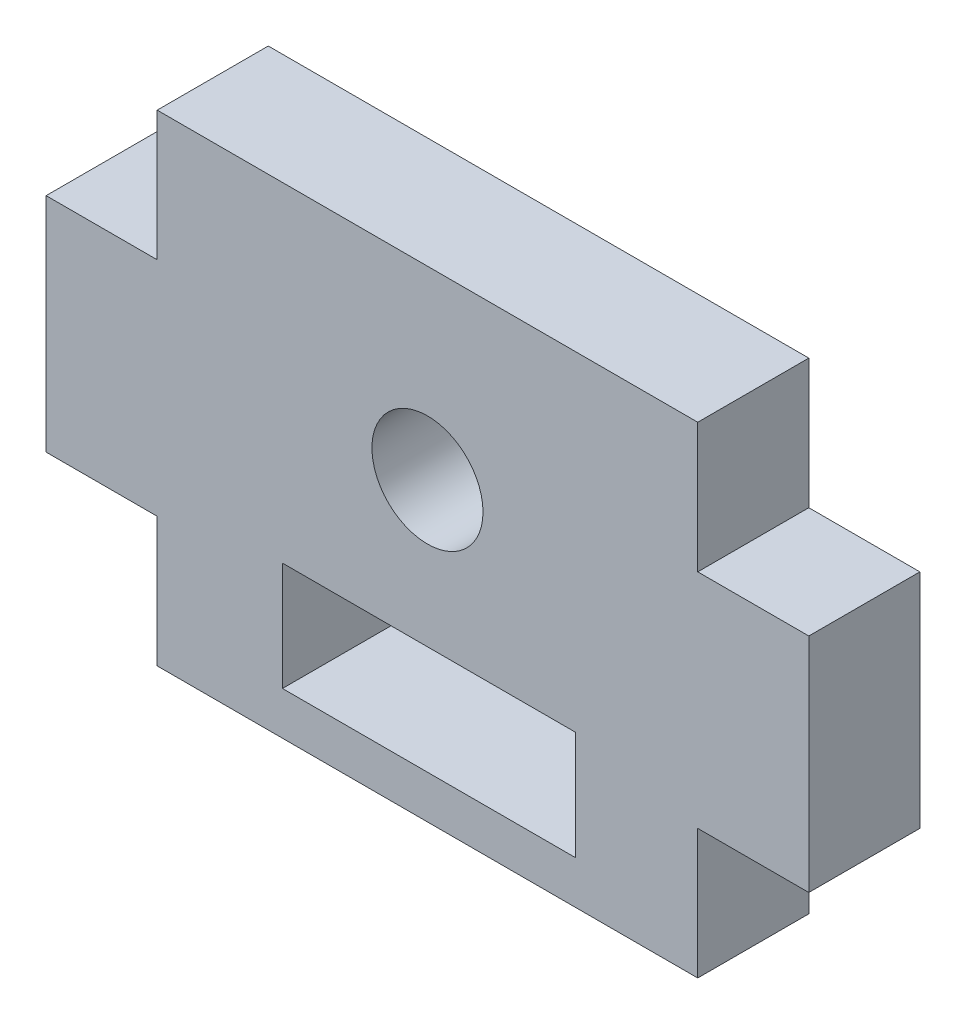
ISO-10303-21;
HEADER;
FILE_DESCRIPTION(('STEP AP214'),'2;1');
FILE_NAME('part.step','',(''),(''),'','','');
FILE_SCHEMA(('AUTOMOTIVE_DESIGN { 1 0 10303 214 1 1 1 1 }'));
ENDSEC;
DATA;
#1=APPLICATION_CONTEXT('core data for automotive mechanical design processes');
#2=APPLICATION_PROTOCOL_DEFINITION('international standard','automotive_design',2000,#1);
#3=PRODUCT_CONTEXT('',#1,'mechanical');
#4=PRODUCT('Part','Part','',(#3));
#5=PRODUCT_RELATED_PRODUCT_CATEGORY('part','',(#4));
#6=PRODUCT_DEFINITION_FORMATION('','',#4);
#7=PRODUCT_DEFINITION_CONTEXT('part definition',#1,'design');
#8=PRODUCT_DEFINITION('design','',#6,#7);
#9=PRODUCT_DEFINITION_SHAPE('','',#8);
#10=(LENGTH_UNIT() NAMED_UNIT(*) SI_UNIT(.MILLI.,.METRE.));
#11=(NAMED_UNIT(*) PLANE_ANGLE_UNIT() SI_UNIT($,.RADIAN.));
#12=(NAMED_UNIT(*) SI_UNIT($,.STERADIAN.) SOLID_ANGLE_UNIT());
#13=UNCERTAINTY_MEASURE_WITH_UNIT(LENGTH_MEASURE(1.E-05),#10,'distance_accuracy_value','');
#14=(GEOMETRIC_REPRESENTATION_CONTEXT(3) GLOBAL_UNCERTAINTY_ASSIGNED_CONTEXT((#13)) GLOBAL_UNIT_ASSIGNED_CONTEXT((#10,
#11,#12)) REPRESENTATION_CONTEXT('',''));
#15=CARTESIAN_POINT('',(0.,0.,0.));
#16=DIRECTION('',(0.,0.,1.));
#17=DIRECTION('',(1.,0.,0.));
#18=AXIS2_PLACEMENT_3D('',#15,#16,#17);
#19=CARTESIAN_POINT('',(0.,-6.5,3.));
#20=DIRECTION('',(0.,1.,0.));
#21=DIRECTION('',(0.,0.,1.));
#22=AXIS2_PLACEMENT_3D('',#19,#20,#21);
#23=PLANE('',#22);
#24=DIRECTION('',(1.,0.,0.));
#25=VECTOR('',#24,1.);
#26=CARTESIAN_POINT('',(0.,-6.5,0.));
#27=LINE('',#26,#25);
#28=CARTESIAN_POINT('',(-7.3,-6.5,0.));
#29=VERTEX_POINT('',#28);
#30=CARTESIAN_POINT('',(7.3,-6.5,0.));
#31=VERTEX_POINT('',#30);
#32=EDGE_CURVE('E213',#29,#31,#27,.T.);
#33=ORIENTED_EDGE('',*,*,#32,.T.);
#34=DIRECTION('',(0.,0.,-1.));
#35=VECTOR('',#34,1.);
#36=CARTESIAN_POINT('',(7.3,-6.5,3.));
#37=LINE('',#36,#35);
#38=CARTESIAN_POINT('',(7.3,-6.5,3.));
#39=VERTEX_POINT('',#38);
#40=EDGE_CURVE('E266',#39,#31,#37,.T.);
#41=ORIENTED_EDGE('',*,*,#40,.F.);
#42=DIRECTION('',(1.,0.,0.));
#43=VECTOR('',#42,1.);
#44=CARTESIAN_POINT('',(0.,-6.5,3.));
#45=LINE('',#44,#43);
#46=CARTESIAN_POINT('',(-7.3,-6.5,3.));
#47=VERTEX_POINT('',#46);
#48=EDGE_CURVE('E184',#47,#39,#45,.T.);
#49=ORIENTED_EDGE('',*,*,#48,.F.);
#50=DIRECTION('',(0.,0.,-1.));
#51=VECTOR('',#50,1.);
#52=CARTESIAN_POINT('',(-7.3,-6.5,3.));
#53=LINE('',#52,#51);
#54=EDGE_CURVE('E242',#47,#29,#53,.T.);
#55=ORIENTED_EDGE('',*,*,#54,.T.);
#56=EDGE_LOOP('',(#33,#41,#49,#55));
#57=FACE_BOUND('',#56,.T.);
#58=ADVANCED_FACE('F42',(#57),#23,.F.);
#59=CARTESIAN_POINT('',(7.3,0.,3.));
#60=DIRECTION('',(-1.,0.,0.));
#61=DIRECTION('',(0.,0.,1.));
#62=AXIS2_PLACEMENT_3D('',#59,#60,#61);
#63=PLANE('',#62);
#64=DIRECTION('',(0.,1.,0.));
#65=VECTOR('',#64,1.);
#66=CARTESIAN_POINT('',(7.3,0.,0.));
#67=LINE('',#66,#65);
#68=CARTESIAN_POINT('',(7.3,-3.,0.));
#69=VERTEX_POINT('',#68);
#70=EDGE_CURVE('E216',#31,#69,#67,.T.);
#71=ORIENTED_EDGE('',*,*,#70,.T.);
#72=DIRECTION('',(0.,0.,-1.));
#73=VECTOR('',#72,1.);
#74=CARTESIAN_POINT('',(7.3,-3.,3.));
#75=LINE('',#74,#73);
#76=CARTESIAN_POINT('',(7.3,-3.,3.));
#77=VERTEX_POINT('',#76);
#78=EDGE_CURVE('E263',#77,#69,#75,.T.);
#79=ORIENTED_EDGE('',*,*,#78,.F.);
#80=DIRECTION('',(0.,1.,0.));
#81=VECTOR('',#80,1.);
#82=CARTESIAN_POINT('',(7.3,0.,3.));
#83=LINE('',#82,#81);
#84=EDGE_CURVE('E187',#39,#77,#83,.T.);
#85=ORIENTED_EDGE('',*,*,#84,.F.);
#86=ORIENTED_EDGE('',*,*,#40,.T.);
#87=EDGE_LOOP('',(#71,#79,#85,#86));
#88=FACE_BOUND('',#87,.T.);
#89=ADVANCED_FACE('F292',(#88),#63,.F.);
#90=CARTESIAN_POINT('',(0.,-3.,3.));
#91=DIRECTION('',(0.,1.,0.));
#92=DIRECTION('',(0.,0.,1.));
#93=AXIS2_PLACEMENT_3D('',#90,#91,#92);
#94=PLANE('',#93);
#95=DIRECTION('',(1.,0.,0.));
#96=VECTOR('',#95,1.);
#97=CARTESIAN_POINT('',(0.,-3.,0.));
#98=LINE('',#97,#96);
#99=CARTESIAN_POINT('',(10.3,-3.,0.));
#100=VERTEX_POINT('',#99);
#101=EDGE_CURVE('E218',#69,#100,#98,.T.);
#102=ORIENTED_EDGE('',*,*,#101,.T.);
#103=DIRECTION('',(0.,0.,-1.));
#104=VECTOR('',#103,1.);
#105=CARTESIAN_POINT('',(10.3,-3.,3.));
#106=LINE('',#105,#104);
#107=CARTESIAN_POINT('',(10.3,-3.,3.));
#108=VERTEX_POINT('',#107);
#109=EDGE_CURVE('E260',#108,#100,#106,.T.);
#110=ORIENTED_EDGE('',*,*,#109,.F.);
#111=DIRECTION('',(1.,0.,0.));
#112=VECTOR('',#111,1.);
#113=CARTESIAN_POINT('',(0.,-3.,3.));
#114=LINE('',#113,#112);
#115=EDGE_CURVE('E190',#77,#108,#114,.T.);
#116=ORIENTED_EDGE('',*,*,#115,.F.);
#117=ORIENTED_EDGE('',*,*,#78,.T.);
#118=EDGE_LOOP('',(#102,#110,#116,#117));
#119=FACE_BOUND('',#118,.T.);
#120=ADVANCED_FACE('F297',(#119),#94,.F.);
#121=CARTESIAN_POINT('',(10.3,0.,3.));
#122=DIRECTION('',(-1.,0.,0.));
#123=DIRECTION('',(0.,0.,1.));
#124=AXIS2_PLACEMENT_3D('',#121,#122,#123);
#125=PLANE('',#124);
#126=DIRECTION('',(0.,1.,0.));
#127=VECTOR('',#126,1.);
#128=CARTESIAN_POINT('',(10.3,0.,0.));
#129=LINE('',#128,#127);
#130=CARTESIAN_POINT('',(10.3,3.,0.));
#131=VERTEX_POINT('',#130);
#132=EDGE_CURVE('E221',#100,#131,#129,.T.);
#133=ORIENTED_EDGE('',*,*,#132,.T.);
#134=DIRECTION('',(0.,0.,-1.));
#135=VECTOR('',#134,1.);
#136=CARTESIAN_POINT('',(10.3,3.,3.));
#137=LINE('',#136,#135);
#138=CARTESIAN_POINT('',(10.3,3.,3.));
#139=VERTEX_POINT('',#138);
#140=EDGE_CURVE('E258',#139,#131,#137,.T.);
#141=ORIENTED_EDGE('',*,*,#140,.F.);
#142=DIRECTION('',(0.,1.,0.));
#143=VECTOR('',#142,1.);
#144=CARTESIAN_POINT('',(10.3,0.,3.));
#145=LINE('',#144,#143);
#146=EDGE_CURVE('E193',#108,#139,#145,.T.);
#147=ORIENTED_EDGE('',*,*,#146,.F.);
#148=ORIENTED_EDGE('',*,*,#109,.T.);
#149=EDGE_LOOP('',(#133,#141,#147,#148));
#150=FACE_BOUND('',#149,.T.);
#151=ADVANCED_FACE('F344',(#150),#125,.F.);
#152=CARTESIAN_POINT('',(0.,3.,3.));
#153=DIRECTION('',(0.,1.,0.));
#154=DIRECTION('',(0.,0.,1.));
#155=AXIS2_PLACEMENT_3D('',#152,#153,#154);
#156=PLANE('',#155);
#157=DIRECTION('',(1.,0.,0.));
#158=VECTOR('',#157,1.);
#159=CARTESIAN_POINT('',(0.,3.,0.));
#160=LINE('',#159,#158);
#161=CARTESIAN_POINT('',(7.3,3.,0.));
#162=VERTEX_POINT('',#161);
#163=EDGE_CURVE('E224',#162,#131,#160,.T.);
#164=ORIENTED_EDGE('',*,*,#163,.F.);
#165=DIRECTION('',(0.,0.,-1.));
#166=VECTOR('',#165,1.);
#167=CARTESIAN_POINT('',(7.3,3.,3.));
#168=LINE('',#167,#166);
#169=CARTESIAN_POINT('',(7.3,3.,3.));
#170=VERTEX_POINT('',#169);
#171=EDGE_CURVE('E256',#170,#162,#168,.T.);
#172=ORIENTED_EDGE('',*,*,#171,.F.);
#173=DIRECTION('',(1.,0.,0.));
#174=VECTOR('',#173,1.);
#175=CARTESIAN_POINT('',(0.,3.,3.));
#176=LINE('',#175,#174);
#177=EDGE_CURVE('E195',#170,#139,#176,.T.);
#178=ORIENTED_EDGE('',*,*,#177,.T.);
#179=ORIENTED_EDGE('',*,*,#140,.T.);
#180=EDGE_LOOP('',(#164,#172,#178,#179));
#181=FACE_BOUND('',#180,.T.);
#182=ADVANCED_FACE('F340',(#181),#156,.T.);
#183=CARTESIAN_POINT('',(7.3,6.5,0.));
#184=VERTEX_POINT('',#183);
#185=EDGE_CURVE('E219',#162,#184,#67,.T.);
#186=ORIENTED_EDGE('',*,*,#185,.T.);
#187=DIRECTION('',(0.,0.,-1.));
#188=VECTOR('',#187,1.);
#189=CARTESIAN_POINT('',(7.3,6.5,3.));
#190=LINE('',#189,#188);
#191=CARTESIAN_POINT('',(7.3,6.5,3.));
#192=VERTEX_POINT('',#191);
#193=EDGE_CURVE('E254',#192,#184,#190,.T.);
#194=ORIENTED_EDGE('',*,*,#193,.F.);
#195=EDGE_CURVE('E191',#170,#192,#83,.T.);
#196=ORIENTED_EDGE('',*,*,#195,.F.);
#197=ORIENTED_EDGE('',*,*,#171,.T.);
#198=EDGE_LOOP('',(#186,#194,#196,#197));
#199=FACE_BOUND('',#198,.T.);
#200=ADVANCED_FACE('F300',(#199),#63,.F.);
#201=CARTESIAN_POINT('',(0.,6.5,3.));
#202=DIRECTION('',(0.,1.,0.));
#203=DIRECTION('',(0.,0.,1.));
#204=AXIS2_PLACEMENT_3D('',#201,#202,#203);
#205=PLANE('',#204);
#206=DIRECTION('',(1.,0.,0.));
#207=VECTOR('',#206,1.);
#208=CARTESIAN_POINT('',(0.,6.5,0.));
#209=LINE('',#208,#207);
#210=CARTESIAN_POINT('',(-7.3,6.5,0.));
#211=VERTEX_POINT('',#210);
#212=EDGE_CURVE('E227',#211,#184,#209,.T.);
#213=ORIENTED_EDGE('',*,*,#212,.F.);
#214=DIRECTION('',(0.,0.,-1.));
#215=VECTOR('',#214,1.);
#216=CARTESIAN_POINT('',(-7.3,6.5,3.));
#217=LINE('',#216,#215);
#218=CARTESIAN_POINT('',(-7.3,6.5,3.));
#219=VERTEX_POINT('',#218);
#220=EDGE_CURVE('E252',#219,#211,#217,.T.);
#221=ORIENTED_EDGE('',*,*,#220,.F.);
#222=DIRECTION('',(1.,0.,0.));
#223=VECTOR('',#222,1.);
#224=CARTESIAN_POINT('',(0.,6.5,3.));
#225=LINE('',#224,#223);
#226=EDGE_CURVE('E198',#219,#192,#225,.T.);
#227=ORIENTED_EDGE('',*,*,#226,.T.);
#228=ORIENTED_EDGE('',*,*,#193,.T.);
#229=EDGE_LOOP('',(#213,#221,#227,#228));
#230=FACE_BOUND('',#229,.T.);
#231=ADVANCED_FACE('F333',(#230),#205,.T.);
#232=CARTESIAN_POINT('',(-7.3,0.,3.));
#233=DIRECTION('',(-1.,0.,0.));
#234=DIRECTION('',(0.,0.,1.));
#235=AXIS2_PLACEMENT_3D('',#232,#233,#234);
#236=PLANE('',#235);
#237=DIRECTION('',(0.,1.,0.));
#238=VECTOR('',#237,1.);
#239=CARTESIAN_POINT('',(-7.3,0.,0.));
#240=LINE('',#239,#238);
#241=CARTESIAN_POINT('',(-7.3,3.,0.));
#242=VERTEX_POINT('',#241);
#243=EDGE_CURVE('E230',#242,#211,#240,.T.);
#244=ORIENTED_EDGE('',*,*,#243,.F.);
#245=DIRECTION('',(0.,0.,-1.));
#246=VECTOR('',#245,1.);
#247=CARTESIAN_POINT('',(-7.3,3.,3.));
#248=LINE('',#247,#246);
#249=CARTESIAN_POINT('',(-7.3,3.,3.));
#250=VERTEX_POINT('',#249);
#251=EDGE_CURVE('E250',#250,#242,#248,.T.);
#252=ORIENTED_EDGE('',*,*,#251,.F.);
#253=DIRECTION('',(0.,1.,0.));
#254=VECTOR('',#253,1.);
#255=CARTESIAN_POINT('',(-7.3,0.,3.));
#256=LINE('',#255,#254);
#257=EDGE_CURVE('E201',#250,#219,#256,.T.);
#258=ORIENTED_EDGE('',*,*,#257,.T.);
#259=ORIENTED_EDGE('',*,*,#220,.T.);
#260=EDGE_LOOP('',(#244,#252,#258,#259));
#261=FACE_BOUND('',#260,.T.);
#262=ADVANCED_FACE('F327',(#261),#236,.T.);
#263=CARTESIAN_POINT('',(0.,3.,3.));
#264=DIRECTION('',(0.,-1.,0.));
#265=DIRECTION('',(0.,0.,-1.));
#266=AXIS2_PLACEMENT_3D('',#263,#264,#265);
#267=PLANE('',#266);
#268=DIRECTION('',(-1.,0.,0.));
#269=VECTOR('',#268,1.);
#270=CARTESIAN_POINT('',(0.,3.,0.));
#271=LINE('',#270,#269);
#272=CARTESIAN_POINT('',(-10.3,3.,0.));
#273=VERTEX_POINT('',#272);
#274=EDGE_CURVE('E233',#242,#273,#271,.T.);
#275=ORIENTED_EDGE('',*,*,#274,.T.);
#276=DIRECTION('',(0.,0.,-1.));
#277=VECTOR('',#276,1.);
#278=CARTESIAN_POINT('',(-10.3,3.,3.));
#279=LINE('',#278,#277);
#280=CARTESIAN_POINT('',(-10.3,3.,3.));
#281=VERTEX_POINT('',#280);
#282=EDGE_CURVE('E248',#281,#273,#279,.T.);
#283=ORIENTED_EDGE('',*,*,#282,.F.);
#284=DIRECTION('',(-1.,0.,0.));
#285=VECTOR('',#284,1.);
#286=CARTESIAN_POINT('',(0.,3.,3.));
#287=LINE('',#286,#285);
#288=EDGE_CURVE('E204',#250,#281,#287,.T.);
#289=ORIENTED_EDGE('',*,*,#288,.F.);
#290=ORIENTED_EDGE('',*,*,#251,.T.);
#291=EDGE_LOOP('',(#275,#283,#289,#290));
#292=FACE_BOUND('',#291,.T.);
#293=ADVANCED_FACE('F324',(#292),#267,.F.);
#294=CARTESIAN_POINT('',(-10.3,0.,3.));
#295=DIRECTION('',(-1.,0.,0.));
#296=DIRECTION('',(0.,0.,1.));
#297=AXIS2_PLACEMENT_3D('',#294,#295,#296);
#298=PLANE('',#297);
#299=DIRECTION('',(0.,1.,0.));
#300=VECTOR('',#299,1.);
#301=CARTESIAN_POINT('',(-10.3,0.,0.));
#302=LINE('',#301,#300);
#303=CARTESIAN_POINT('',(-10.3,-3.,0.));
#304=VERTEX_POINT('',#303);
#305=EDGE_CURVE('E236',#304,#273,#302,.T.);
#306=ORIENTED_EDGE('',*,*,#305,.F.);
#307=DIRECTION('',(0.,0.,-1.));
#308=VECTOR('',#307,1.);
#309=CARTESIAN_POINT('',(-10.3,-3.,3.));
#310=LINE('',#309,#308);
#311=CARTESIAN_POINT('',(-10.3,-3.,3.));
#312=VERTEX_POINT('',#311);
#313=EDGE_CURVE('E246',#312,#304,#310,.T.);
#314=ORIENTED_EDGE('',*,*,#313,.F.);
#315=DIRECTION('',(0.,1.,0.));
#316=VECTOR('',#315,1.);
#317=CARTESIAN_POINT('',(-10.3,0.,3.));
#318=LINE('',#317,#316);
#319=EDGE_CURVE('E207',#312,#281,#318,.T.);
#320=ORIENTED_EDGE('',*,*,#319,.T.);
#321=ORIENTED_EDGE('',*,*,#282,.T.);
#322=EDGE_LOOP('',(#306,#314,#320,#321));
#323=FACE_BOUND('',#322,.T.);
#324=ADVANCED_FACE('F319',(#323),#298,.T.);
#325=CARTESIAN_POINT('',(0.,-3.,3.));
#326=DIRECTION('',(0.,-1.,0.));
#327=DIRECTION('',(1.,0.,0.));
#328=AXIS2_PLACEMENT_3D('',#325,#326,#327);
#329=PLANE('',#328);
#330=DIRECTION('',(-1.,0.,0.));
#331=VECTOR('',#330,1.);
#332=CARTESIAN_POINT('',(0.,-3.,0.));
#333=LINE('',#332,#331);
#334=CARTESIAN_POINT('',(-7.3,-3.,0.));
#335=VERTEX_POINT('',#334);
#336=EDGE_CURVE('E239',#335,#304,#333,.T.);
#337=ORIENTED_EDGE('',*,*,#336,.F.);
#338=DIRECTION('',(0.,0.,-1.));
#339=VECTOR('',#338,1.);
#340=CARTESIAN_POINT('',(-7.3,-3.,3.));
#341=LINE('',#340,#339);
#342=CARTESIAN_POINT('',(-7.3,-3.,3.));
#343=VERTEX_POINT('',#342);
#344=EDGE_CURVE('E244',#343,#335,#341,.T.);
#345=ORIENTED_EDGE('',*,*,#344,.F.);
#346=DIRECTION('',(-1.,0.,0.));
#347=VECTOR('',#346,1.);
#348=CARTESIAN_POINT('',(0.,-3.,3.));
#349=LINE('',#348,#347);
#350=EDGE_CURVE('E210',#343,#312,#349,.T.);
#351=ORIENTED_EDGE('',*,*,#350,.T.);
#352=ORIENTED_EDGE('',*,*,#313,.T.);
#353=EDGE_LOOP('',(#337,#345,#351,#352));
#354=FACE_BOUND('',#353,.T.);
#355=ADVANCED_FACE('F314',(#354),#329,.T.);
#356=EDGE_CURVE('E188',#29,#335,#240,.T.);
#357=ORIENTED_EDGE('',*,*,#356,.F.);
#358=ORIENTED_EDGE('',*,*,#54,.F.);
#359=EDGE_CURVE('E205',#47,#343,#256,.T.);
#360=ORIENTED_EDGE('',*,*,#359,.T.);
#361=ORIENTED_EDGE('',*,*,#344,.T.);
#362=EDGE_LOOP('',(#357,#358,#360,#361));
#363=FACE_BOUND('',#362,.T.);
#364=ADVANCED_FACE('F308',(#363),#236,.T.);
#365=CARTESIAN_POINT('',(0.,0.,3.));
#366=DIRECTION('',(0.,0.,1.));
#367=DIRECTION('',(1.,0.,0.));
#368=AXIS2_PLACEMENT_3D('',#365,#366,#367);
#369=PLANE('',#368);
#370=CARTESIAN_POINT('',(0.,1.49999999999999,3.));
#371=DIRECTION('',(0.,0.,1.));
#372=DIRECTION('',(1.,0.,0.));
#373=AXIS2_PLACEMENT_3D('',#370,#371,#372);
#374=CIRCLE('',#373,1.5);
#375=CARTESIAN_POINT('',(1.49999999999998,1.49999999999999,3.));
#376=VERTEX_POINT('',#375);
#377=EDGE_CURVE('E181',#376,#376,#374,.T.);
#378=ORIENTED_EDGE('',*,*,#377,.F.);
#379=EDGE_LOOP('',(#378));
#380=FACE_BOUND('',#379,.T.);
#381=DIRECTION('',(0.,-1.,0.));
#382=VECTOR('',#381,1.);
#383=CARTESIAN_POINT('',(-3.91664350068261,-2.40308459669248,3.));
#384=LINE('',#383,#382);
#385=CARTESIAN_POINT('',(-3.91664350068261,-2.40308459669248,3.));
#386=VERTEX_POINT('',#385);
#387=CARTESIAN_POINT('',(-3.91664350068261,-5.33628679714409,3.));
#388=VERTEX_POINT('',#387);
#389=EDGE_CURVE('E57',#386,#388,#384,.T.);
#390=ORIENTED_EDGE('',*,*,#389,.F.);
#391=DIRECTION('',(-1.,0.,0.));
#392=VECTOR('',#391,1.);
#393=CARTESIAN_POINT('',(-3.91664350068261,-2.40308459669248,3.));
#394=LINE('',#393,#392);
#395=CARTESIAN_POINT('',(3.99338538414182,-2.40308459669248,3.));
#396=VERTEX_POINT('',#395);
#397=EDGE_CURVE('E174',#396,#386,#394,.T.);
#398=ORIENTED_EDGE('',*,*,#397,.F.);
#399=DIRECTION('',(0.,1.,0.));
#400=VECTOR('',#399,1.);
#401=CARTESIAN_POINT('',(3.99338538414182,-2.40308459669248,3.));
#402=LINE('',#401,#400);
#403=CARTESIAN_POINT('',(3.99338538414182,-5.33628679714409,3.));
#404=VERTEX_POINT('',#403);
#405=EDGE_CURVE('E158',#404,#396,#402,.T.);
#406=ORIENTED_EDGE('',*,*,#405,.F.);
#407=DIRECTION('',(1.,0.,0.));
#408=VECTOR('',#407,1.);
#409=CARTESIAN_POINT('',(-3.91664350068261,-5.33628679714409,3.));
#410=LINE('',#409,#408);
#411=EDGE_CURVE('E167',#388,#404,#410,.T.);
#412=ORIENTED_EDGE('',*,*,#411,.F.);
#413=EDGE_LOOP('',(#390,#398,#406,#412));
#414=FACE_BOUND('',#413,.T.);
#415=ORIENTED_EDGE('',*,*,#48,.T.);
#416=ORIENTED_EDGE('',*,*,#84,.T.);
#417=ORIENTED_EDGE('',*,*,#115,.T.);
#418=ORIENTED_EDGE('',*,*,#146,.T.);
#419=ORIENTED_EDGE('',*,*,#177,.F.);
#420=ORIENTED_EDGE('',*,*,#195,.T.);
#421=ORIENTED_EDGE('',*,*,#226,.F.);
#422=ORIENTED_EDGE('',*,*,#257,.F.);
#423=ORIENTED_EDGE('',*,*,#288,.T.);
#424=ORIENTED_EDGE('',*,*,#319,.F.);
#425=ORIENTED_EDGE('',*,*,#350,.F.);
#426=ORIENTED_EDGE('',*,*,#359,.F.);
#427=EDGE_LOOP('',(#415,#416,#417,#418,#419,#420,#421,#422,#423,#424,#425,#426));
#428=FACE_BOUND('',#427,.T.);
#429=ADVANCED_FACE('F171',(#380,#414,#428),#369,.T.);
#430=CARTESIAN_POINT('',(0.,0.,0.));
#431=DIRECTION('',(0.,0.,1.));
#432=DIRECTION('',(1.,0.,0.));
#433=AXIS2_PLACEMENT_3D('',#430,#431,#432);
#434=PLANE('',#433);
#435=CARTESIAN_POINT('',(0.,1.49999999999999,0.));
#436=DIRECTION('',(0.,0.,1.));
#437=DIRECTION('',(1.,0.,0.));
#438=AXIS2_PLACEMENT_3D('',#435,#436,#437);
#439=CIRCLE('',#438,1.5);
#440=CARTESIAN_POINT('',(1.49999999999998,1.49999999999999,0.));
#441=VERTEX_POINT('',#440);
#442=EDGE_CURVE('E45',#441,#441,#439,.T.);
#443=ORIENTED_EDGE('',*,*,#442,.T.);
#444=EDGE_LOOP('',(#443));
#445=FACE_BOUND('',#444,.T.);
#446=DIRECTION('',(-1.,0.,0.));
#447=VECTOR('',#446,1.);
#448=CARTESIAN_POINT('',(0.,-2.40308459669248,0.));
#449=LINE('',#448,#447);
#450=CARTESIAN_POINT('',(3.99338538414182,-2.40308459669248,0.));
#451=VERTEX_POINT('',#450);
#452=CARTESIAN_POINT('',(-3.91664350068261,-2.40308459669248,0.));
#453=VERTEX_POINT('',#452);
#454=EDGE_CURVE('E50',#451,#453,#449,.T.);
#455=ORIENTED_EDGE('',*,*,#454,.T.);
#456=DIRECTION('',(0.,-1.,0.));
#457=VECTOR('',#456,1.);
#458=CARTESIAN_POINT('',(-3.91664350068261,0.,0.));
#459=LINE('',#458,#457);
#460=CARTESIAN_POINT('',(-3.91664350068261,-5.33628679714409,0.));
#461=VERTEX_POINT('',#460);
#462=EDGE_CURVE('E11',#453,#461,#459,.T.);
#463=ORIENTED_EDGE('',*,*,#462,.T.);
#464=DIRECTION('',(1.,0.,0.));
#465=VECTOR('',#464,1.);
#466=CARTESIAN_POINT('',(0.,-5.33628679714409,0.));
#467=LINE('',#466,#465);
#468=CARTESIAN_POINT('',(3.99338538414182,-5.33628679714409,0.));
#469=VERTEX_POINT('',#468);
#470=EDGE_CURVE('E269',#461,#469,#467,.T.);
#471=ORIENTED_EDGE('',*,*,#470,.T.);
#472=DIRECTION('',(0.,1.,0.));
#473=VECTOR('',#472,1.);
#474=CARTESIAN_POINT('',(3.99338538414182,0.,0.));
#475=LINE('',#474,#473);
#476=EDGE_CURVE('E161',#469,#451,#475,.T.);
#477=ORIENTED_EDGE('',*,*,#476,.T.);
#478=EDGE_LOOP('',(#455,#463,#471,#477));
#479=FACE_BOUND('',#478,.T.);
#480=ORIENTED_EDGE('',*,*,#32,.F.);
#481=ORIENTED_EDGE('',*,*,#356,.T.);
#482=ORIENTED_EDGE('',*,*,#336,.T.);
#483=ORIENTED_EDGE('',*,*,#305,.T.);
#484=ORIENTED_EDGE('',*,*,#274,.F.);
#485=ORIENTED_EDGE('',*,*,#243,.T.);
#486=ORIENTED_EDGE('',*,*,#212,.T.);
#487=ORIENTED_EDGE('',*,*,#185,.F.);
#488=ORIENTED_EDGE('',*,*,#163,.T.);
#489=ORIENTED_EDGE('',*,*,#132,.F.);
#490=ORIENTED_EDGE('',*,*,#101,.F.);
#491=ORIENTED_EDGE('',*,*,#70,.F.);
#492=EDGE_LOOP('',(#480,#481,#482,#483,#484,#485,#486,#487,#488,#489,#490,#491));
#493=FACE_BOUND('',#492,.T.);
#494=ADVANCED_FACE('F274',(#445,#479,#493),#434,.F.);
#495=CARTESIAN_POINT('',(-3.91664350068261,-2.40308459669248,-7.));
#496=DIRECTION('',(-1.,0.,0.));
#497=DIRECTION('',(0.,0.,1.));
#498=AXIS2_PLACEMENT_3D('',#495,#496,#497);
#499=PLANE('',#498);
#500=DIRECTION('',(0.,0.,1.));
#501=VECTOR('',#500,1.);
#502=CARTESIAN_POINT('',(-3.91664350068261,-2.40308459669248,-7.));
#503=LINE('',#502,#501);
#504=EDGE_CURVE('E179',#453,#386,#503,.T.);
#505=ORIENTED_EDGE('',*,*,#504,.T.);
#506=ORIENTED_EDGE('',*,*,#389,.T.);
#507=DIRECTION('',(0.,0.,1.));
#508=VECTOR('',#507,1.);
#509=CARTESIAN_POINT('',(-3.91664350068261,-5.33628679714409,-7.));
#510=LINE('',#509,#508);
#511=EDGE_CURVE('E164',#461,#388,#510,.T.);
#512=ORIENTED_EDGE('',*,*,#511,.F.);
#513=ORIENTED_EDGE('',*,*,#462,.F.);
#514=EDGE_LOOP('',(#505,#506,#512,#513));
#515=FACE_BOUND('',#514,.T.);
#516=ADVANCED_FACE('F279',(#515),#499,.F.);
#517=CARTESIAN_POINT('',(-3.91664350068261,-2.40308459669248,-7.));
#518=DIRECTION('',(0.,1.,0.));
#519=DIRECTION('',(0.,0.,1.));
#520=AXIS2_PLACEMENT_3D('',#517,#518,#519);
#521=PLANE('',#520);
#522=DIRECTION('',(0.,0.,1.));
#523=VECTOR('',#522,1.);
#524=CARTESIAN_POINT('',(3.99338538414182,-2.40308459669248,-7.));
#525=LINE('',#524,#523);
#526=EDGE_CURVE('E163',#451,#396,#525,.T.);
#527=ORIENTED_EDGE('',*,*,#526,.T.);
#528=ORIENTED_EDGE('',*,*,#397,.T.);
#529=ORIENTED_EDGE('',*,*,#504,.F.);
#530=ORIENTED_EDGE('',*,*,#454,.F.);
#531=EDGE_LOOP('',(#527,#528,#529,#530));
#532=FACE_BOUND('',#531,.T.);
#533=ADVANCED_FACE('F278',(#532),#521,.F.);
#534=CARTESIAN_POINT('',(3.99338538414182,-2.40308459669248,-7.));
#535=DIRECTION('',(1.,0.,0.));
#536=DIRECTION('',(0.,0.,-1.));
#537=AXIS2_PLACEMENT_3D('',#534,#535,#536);
#538=PLANE('',#537);
#539=DIRECTION('',(0.,0.,1.));
#540=VECTOR('',#539,1.);
#541=CARTESIAN_POINT('',(3.99338538414182,-5.33628679714409,-7.));
#542=LINE('',#541,#540);
#543=EDGE_CURVE('E65',#469,#404,#542,.T.);
#544=ORIENTED_EDGE('',*,*,#543,.T.);
#545=ORIENTED_EDGE('',*,*,#405,.T.);
#546=ORIENTED_EDGE('',*,*,#526,.F.);
#547=ORIENTED_EDGE('',*,*,#476,.F.);
#548=EDGE_LOOP('',(#544,#545,#546,#547));
#549=FACE_BOUND('',#548,.T.);
#550=ADVANCED_FACE('F155',(#549),#538,.F.);
#551=CARTESIAN_POINT('',(-3.91664350068261,-5.33628679714409,-7.));
#552=DIRECTION('',(0.,-1.,0.));
#553=DIRECTION('',(0.,0.,-1.));
#554=AXIS2_PLACEMENT_3D('',#551,#552,#553);
#555=PLANE('',#554);
#556=ORIENTED_EDGE('',*,*,#511,.T.);
#557=ORIENTED_EDGE('',*,*,#411,.T.);
#558=ORIENTED_EDGE('',*,*,#543,.F.);
#559=ORIENTED_EDGE('',*,*,#470,.F.);
#560=EDGE_LOOP('',(#556,#557,#558,#559));
#561=FACE_BOUND('',#560,.T.);
#562=ADVANCED_FACE('F168',(#561),#555,.F.);
#563=CARTESIAN_POINT('',(0.,1.49999999999999,-7.));
#564=DIRECTION('',(0.,0.,1.));
#565=DIRECTION('',(1.,0.,0.));
#566=AXIS2_PLACEMENT_3D('',#563,#564,#565);
#567=CYLINDRICAL_SURFACE('',#566,1.5);
#568=ORIENTED_EDGE('',*,*,#377,.T.);
#569=EDGE_LOOP('',(#568));
#570=FACE_BOUND('',#569,.T.);
#571=ORIENTED_EDGE('',*,*,#442,.F.);
#572=EDGE_LOOP('',(#571));
#573=FACE_BOUND('',#572,.T.);
#574=ADVANCED_FACE('F454',(#570,#573),#567,.F.);
#575=CLOSED_SHELL('',(#58,#89,#120,#151,#182,#200,#231,#262,#293,#324,#355,#364,#429,#494,#516,
#533,#550,#562,#574));
#576=MANIFOLD_SOLID_BREP('B2',#575);
#577=ADVANCED_BREP_SHAPE_REPRESENTATION('',(#18,#576),#14);
#578=SHAPE_DEFINITION_REPRESENTATION(#9,#577);
ENDSEC;
END-ISO-10303-21;
